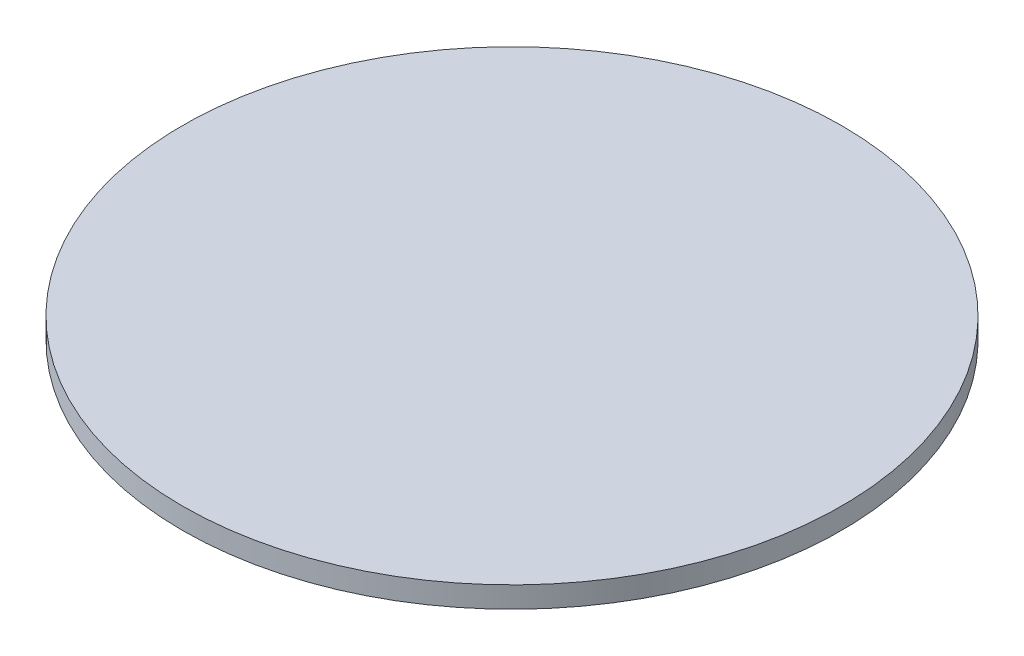
ISO-10303-21;
HEADER;
FILE_DESCRIPTION(('STEP AP214'),'2;1');
FILE_NAME('part.step','',(''),(''),'','','');
FILE_SCHEMA(('AUTOMOTIVE_DESIGN { 1 0 10303 214 1 1 1 1 }'));
ENDSEC;
DATA;
#1=APPLICATION_CONTEXT('core data for automotive mechanical design processes');
#2=APPLICATION_PROTOCOL_DEFINITION('international standard','automotive_design',2000,#1);
#3=PRODUCT_CONTEXT('',#1,'mechanical');
#4=PRODUCT('Part','Part','',(#3));
#5=PRODUCT_RELATED_PRODUCT_CATEGORY('part','',(#4));
#6=PRODUCT_DEFINITION_FORMATION('','',#4);
#7=PRODUCT_DEFINITION_CONTEXT('part definition',#1,'design');
#8=PRODUCT_DEFINITION('design','',#6,#7);
#9=PRODUCT_DEFINITION_SHAPE('','',#8);
#10=(LENGTH_UNIT() NAMED_UNIT(*) SI_UNIT(.MILLI.,.METRE.));
#11=(NAMED_UNIT(*) PLANE_ANGLE_UNIT() SI_UNIT($,.RADIAN.));
#12=(NAMED_UNIT(*) SI_UNIT($,.STERADIAN.) SOLID_ANGLE_UNIT());
#13=UNCERTAINTY_MEASURE_WITH_UNIT(LENGTH_MEASURE(1.E-05),#10,'distance_accuracy_value','');
#14=(GEOMETRIC_REPRESENTATION_CONTEXT(3) GLOBAL_UNCERTAINTY_ASSIGNED_CONTEXT((#13)) GLOBAL_UNIT_ASSIGNED_CONTEXT((#10,
#11,#12)) REPRESENTATION_CONTEXT('',''));
#15=CARTESIAN_POINT('',(0.,0.,0.));
#16=DIRECTION('',(0.,0.,1.));
#17=DIRECTION('',(1.,0.,0.));
#18=AXIS2_PLACEMENT_3D('',#15,#16,#17);
#19=CARTESIAN_POINT('',(0.,3.175,0.));
#20=DIRECTION('',(0.,-1.,0.));
#21=DIRECTION('',(0.,0.,-1.));
#22=AXIS2_PLACEMENT_3D('',#19,#20,#21);
#23=CYLINDRICAL_SURFACE('',#22,49.53);
#24=CARTESIAN_POINT('',(0.,3.175,0.));
#25=DIRECTION('',(0.,1.,0.));
#26=DIRECTION('',(0.,0.,1.));
#27=AXIS2_PLACEMENT_3D('',#24,#25,#26);
#28=CIRCLE('',#27,49.53);
#29=CARTESIAN_POINT('',(0.,3.175,49.53));
#30=VERTEX_POINT('',#29);
#31=EDGE_CURVE('E10',#30,#30,#28,.T.);
#32=ORIENTED_EDGE('',*,*,#31,.F.);
#33=EDGE_LOOP('',(#32));
#34=FACE_BOUND('',#33,.T.);
#35=CARTESIAN_POINT('',(0.,0.,0.));
#36=DIRECTION('',(0.,1.,0.));
#37=DIRECTION('',(0.,0.,1.));
#38=AXIS2_PLACEMENT_3D('',#35,#36,#37);
#39=CIRCLE('',#38,49.53);
#40=CARTESIAN_POINT('',(0.,0.,49.53));
#41=VERTEX_POINT('',#40);
#42=EDGE_CURVE('E42',#41,#41,#39,.T.);
#43=ORIENTED_EDGE('',*,*,#42,.T.);
#44=EDGE_LOOP('',(#43));
#45=FACE_BOUND('',#44,.T.);
#46=ADVANCED_FACE('F41',(#34,#45),#23,.T.);
#47=CARTESIAN_POINT('',(0.,3.175,0.));
#48=DIRECTION('',(0.,1.,0.));
#49=DIRECTION('',(0.,0.,1.));
#50=AXIS2_PLACEMENT_3D('',#47,#48,#49);
#51=PLANE('',#50);
#52=ORIENTED_EDGE('',*,*,#31,.T.);
#53=EDGE_LOOP('',(#52));
#54=FACE_BOUND('',#53,.T.);
#55=ADVANCED_FACE('F57',(#54),#51,.T.);
#56=CARTESIAN_POINT('',(0.,0.,0.));
#57=DIRECTION('',(0.,1.,0.));
#58=DIRECTION('',(0.,0.,1.));
#59=AXIS2_PLACEMENT_3D('',#56,#57,#58);
#60=PLANE('',#59);
#61=ORIENTED_EDGE('',*,*,#42,.F.);
#62=EDGE_LOOP('',(#61));
#63=FACE_BOUND('',#62,.T.);
#64=ADVANCED_FACE('F53',(#63),#60,.F.);
#65=CLOSED_SHELL('',(#46,#55,#64));
#66=MANIFOLD_SOLID_BREP('B2',#65);
#67=ADVANCED_BREP_SHAPE_REPRESENTATION('',(#18,#66),#14);
#68=SHAPE_DEFINITION_REPRESENTATION(#9,#67);
ENDSEC;
END-ISO-10303-21;
